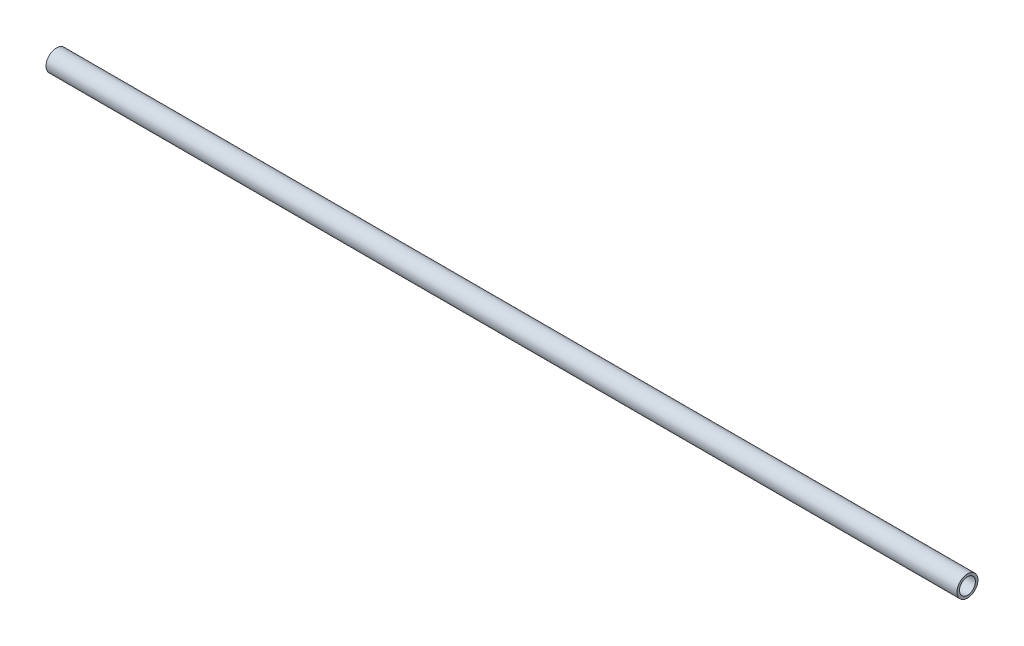
ISO-10303-21;
HEADER;
FILE_DESCRIPTION(('STEP AP214'),'2;1');
FILE_NAME('part.step','',(''),(''),'','','');
FILE_SCHEMA(('AUTOMOTIVE_DESIGN { 1 0 10303 214 1 1 1 1 }'));
ENDSEC;
DATA;
#1=APPLICATION_CONTEXT('core data for automotive mechanical design processes');
#2=APPLICATION_PROTOCOL_DEFINITION('international standard','automotive_design',2000,#1);
#3=PRODUCT_CONTEXT('',#1,'mechanical');
#4=PRODUCT('Part','Part','',(#3));
#5=PRODUCT_RELATED_PRODUCT_CATEGORY('part','',(#4));
#6=PRODUCT_DEFINITION_FORMATION('','',#4);
#7=PRODUCT_DEFINITION_CONTEXT('part definition',#1,'design');
#8=PRODUCT_DEFINITION('design','',#6,#7);
#9=PRODUCT_DEFINITION_SHAPE('','',#8);
#10=(LENGTH_UNIT() NAMED_UNIT(*) SI_UNIT(.MILLI.,.METRE.));
#11=(NAMED_UNIT(*) PLANE_ANGLE_UNIT() SI_UNIT($,.RADIAN.));
#12=(NAMED_UNIT(*) SI_UNIT($,.STERADIAN.) SOLID_ANGLE_UNIT());
#13=UNCERTAINTY_MEASURE_WITH_UNIT(LENGTH_MEASURE(1.E-05),#10,'distance_accuracy_value','');
#14=(GEOMETRIC_REPRESENTATION_CONTEXT(3) GLOBAL_UNCERTAINTY_ASSIGNED_CONTEXT((#13)) GLOBAL_UNIT_ASSIGNED_CONTEXT((#10,
#11,#12)) REPRESENTATION_CONTEXT('',''));
#15=CARTESIAN_POINT('',(0.,0.,0.));
#16=DIRECTION('',(0.,0.,1.));
#17=DIRECTION('',(1.,0.,0.));
#18=AXIS2_PLACEMENT_3D('',#15,#16,#17);
#19=CARTESIAN_POINT('',(1100.,0.,0.));
#20=DIRECTION('',(1.,0.,0.));
#21=DIRECTION('',(0.,0.,-1.));
#22=AXIS2_PLACEMENT_3D('',#19,#20,#21);
#23=PLANE('',#22);
#24=CARTESIAN_POINT('',(1100.,0.,0.));
#25=DIRECTION('',(1.,0.,0.));
#26=DIRECTION('',(0.,0.,-1.));
#27=AXIS2_PLACEMENT_3D('',#24,#25,#26);
#28=CIRCLE('',#27,12.7);
#29=CARTESIAN_POINT('',(1100.,0.,-12.7));
#30=VERTEX_POINT('',#29);
#31=EDGE_CURVE('E10',#30,#30,#28,.T.);
#32=ORIENTED_EDGE('',*,*,#31,.T.);
#33=EDGE_LOOP('',(#32));
#34=FACE_BOUND('',#33,.T.);
#35=CARTESIAN_POINT('',(1100.,0.,0.));
#36=DIRECTION('',(1.,0.,0.));
#37=DIRECTION('',(0.,0.,-1.));
#38=AXIS2_PLACEMENT_3D('',#35,#36,#37);
#39=CIRCLE('',#38,9.652);
#40=CARTESIAN_POINT('',(1100.,0.,-9.652));
#41=VERTEX_POINT('',#40);
#42=EDGE_CURVE('E45',#41,#41,#39,.T.);
#43=ORIENTED_EDGE('',*,*,#42,.F.);
#44=EDGE_LOOP('',(#43));
#45=FACE_BOUND('',#44,.T.);
#46=ADVANCED_FACE('F34',(#34,#45),#23,.T.);
#47=CARTESIAN_POINT('',(0.,0.,0.));
#48=DIRECTION('',(1.,0.,0.));
#49=DIRECTION('',(0.,0.,-1.));
#50=AXIS2_PLACEMENT_3D('',#47,#48,#49);
#51=PLANE('',#50);
#52=CARTESIAN_POINT('',(0.,0.,0.));
#53=DIRECTION('',(1.,0.,0.));
#54=DIRECTION('',(0.,0.,-1.));
#55=AXIS2_PLACEMENT_3D('',#52,#53,#54);
#56=CIRCLE('',#55,12.7);
#57=CARTESIAN_POINT('',(0.,0.,-12.7));
#58=VERTEX_POINT('',#57);
#59=EDGE_CURVE('E38',#58,#58,#56,.T.);
#60=ORIENTED_EDGE('',*,*,#59,.F.);
#61=EDGE_LOOP('',(#60));
#62=FACE_BOUND('',#61,.T.);
#63=CARTESIAN_POINT('',(0.,0.,0.));
#64=DIRECTION('',(1.,0.,0.));
#65=DIRECTION('',(0.,0.,-1.));
#66=AXIS2_PLACEMENT_3D('',#63,#64,#65);
#67=CIRCLE('',#66,9.652);
#68=CARTESIAN_POINT('',(0.,0.,-9.652));
#69=VERTEX_POINT('',#68);
#70=EDGE_CURVE('E47',#69,#69,#67,.T.);
#71=ORIENTED_EDGE('',*,*,#70,.T.);
#72=EDGE_LOOP('',(#71));
#73=FACE_BOUND('',#72,.T.);
#74=ADVANCED_FACE('F57',(#62,#73),#51,.F.);
#75=CARTESIAN_POINT('',(1100.,0.,0.));
#76=DIRECTION('',(-1.,0.,0.));
#77=DIRECTION('',(0.,0.,1.));
#78=AXIS2_PLACEMENT_3D('',#75,#76,#77);
#79=CYLINDRICAL_SURFACE('',#78,12.7);
#80=ORIENTED_EDGE('',*,*,#31,.F.);
#81=EDGE_LOOP('',(#80));
#82=FACE_BOUND('',#81,.T.);
#83=ORIENTED_EDGE('',*,*,#59,.T.);
#84=EDGE_LOOP('',(#83));
#85=FACE_BOUND('',#84,.T.);
#86=ADVANCED_FACE('F36',(#82,#85),#79,.T.);
#87=CARTESIAN_POINT('',(1100.,0.,0.));
#88=DIRECTION('',(-1.,0.,0.));
#89=DIRECTION('',(0.,0.,1.));
#90=AXIS2_PLACEMENT_3D('',#87,#88,#89);
#91=CYLINDRICAL_SURFACE('',#90,9.652);
#92=ORIENTED_EDGE('',*,*,#42,.T.);
#93=EDGE_LOOP('',(#92));
#94=FACE_BOUND('',#93,.T.);
#95=ORIENTED_EDGE('',*,*,#70,.F.);
#96=EDGE_LOOP('',(#95));
#97=FACE_BOUND('',#96,.T.);
#98=ADVANCED_FACE('F53',(#94,#97),#91,.F.);
#99=CLOSED_SHELL('',(#46,#74,#86,#98));
#100=MANIFOLD_SOLID_BREP('B2',#99);
#101=ADVANCED_BREP_SHAPE_REPRESENTATION('',(#18,#100),#14);
#102=SHAPE_DEFINITION_REPRESENTATION(#9,#101);
ENDSEC;
END-ISO-10303-21;
